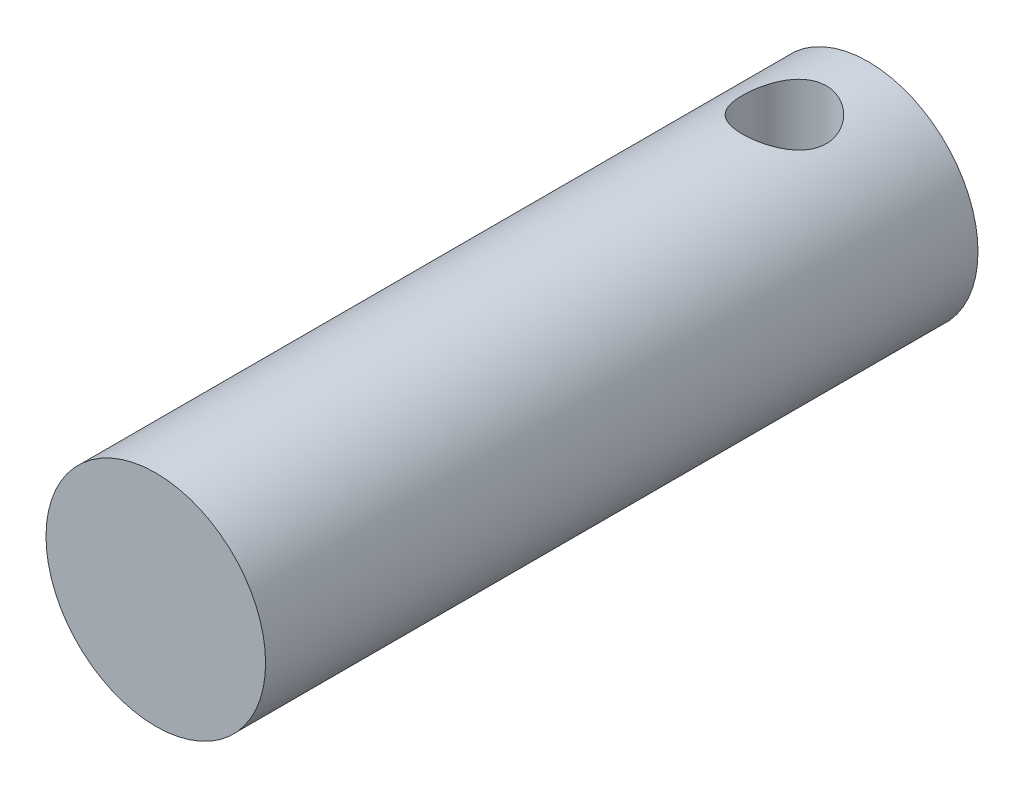
ISO-10303-21;
HEADER;
FILE_DESCRIPTION(('STEP AP214'),'2;1');
FILE_NAME('part.step','',(''),(''),'','','');
FILE_SCHEMA(('AUTOMOTIVE_DESIGN { 1 0 10303 214 1 1 1 1 }'));
ENDSEC;
DATA;
#1=APPLICATION_CONTEXT('core data for automotive mechanical design processes');
#2=APPLICATION_PROTOCOL_DEFINITION('international standard','automotive_design',2000,#1);
#3=PRODUCT_CONTEXT('',#1,'mechanical');
#4=PRODUCT('Part','Part','',(#3));
#5=PRODUCT_RELATED_PRODUCT_CATEGORY('part','',(#4));
#6=PRODUCT_DEFINITION_FORMATION('','',#4);
#7=PRODUCT_DEFINITION_CONTEXT('part definition',#1,'design');
#8=PRODUCT_DEFINITION('design','',#6,#7);
#9=PRODUCT_DEFINITION_SHAPE('','',#8);
#10=(LENGTH_UNIT() NAMED_UNIT(*) SI_UNIT(.MILLI.,.METRE.));
#11=(NAMED_UNIT(*) PLANE_ANGLE_UNIT() SI_UNIT($,.RADIAN.));
#12=(NAMED_UNIT(*) SI_UNIT($,.STERADIAN.) SOLID_ANGLE_UNIT());
#13=UNCERTAINTY_MEASURE_WITH_UNIT(LENGTH_MEASURE(1.E-05),#10,'distance_accuracy_value','');
#14=(GEOMETRIC_REPRESENTATION_CONTEXT(3) GLOBAL_UNCERTAINTY_ASSIGNED_CONTEXT((#13)) GLOBAL_UNIT_ASSIGNED_CONTEXT((#10,
#11,#12)) REPRESENTATION_CONTEXT('',''));
#15=CARTESIAN_POINT('',(0.,0.,0.));
#16=DIRECTION('',(0.,0.,1.));
#17=DIRECTION('',(1.,0.,0.));
#18=AXIS2_PLACEMENT_3D('',#15,#16,#17);
#19=CARTESIAN_POINT('',(0.,0.,17.));
#20=DIRECTION('',(0.,0.,-1.));
#21=DIRECTION('',(-1.,0.,0.));
#22=AXIS2_PLACEMENT_3D('',#19,#20,#21);
#23=CYLINDRICAL_SURFACE('',#22,2.62);
#24=CARTESIAN_POINT('',(0.,0.,17.));
#25=DIRECTION('',(0.,0.,1.));
#26=DIRECTION('',(1.,0.,0.));
#27=AXIS2_PLACEMENT_3D('',#24,#25,#26);
#28=CIRCLE('',#27,2.62);
#29=CARTESIAN_POINT('',(2.62,0.,17.));
#30=VERTEX_POINT('',#29);
#31=EDGE_CURVE('E10',#30,#30,#28,.T.);
#32=ORIENTED_EDGE('',*,*,#31,.F.);
#33=EDGE_LOOP('',(#32));
#34=FACE_BOUND('',#33,.T.);
#35=CARTESIAN_POINT('',(0.,0.,0.));
#36=DIRECTION('',(0.,0.,1.));
#37=DIRECTION('',(1.,0.,0.));
#38=AXIS2_PLACEMENT_3D('',#35,#36,#37);
#39=CIRCLE('',#38,2.62);
#40=CARTESIAN_POINT('',(2.62,0.,0.));
#41=VERTEX_POINT('',#40);
#42=EDGE_CURVE('E50',#41,#41,#39,.T.);
#43=ORIENTED_EDGE('',*,*,#42,.T.);
#44=EDGE_LOOP('',(#43));
#45=FACE_BOUND('',#44,.T.);
#46=CARTESIAN_POINT('',(0.,-2.62,1.));
#47=CARTESIAN_POINT('',(0.0540878208666477,-2.62000172446684,0.99999772664512));
#48=CARTESIAN_POINT('',(0.108160366600469,-2.61831068498683,1.00440183677598));
#49=CARTESIAN_POINT('',(0.214685738804756,-2.61173428545876,1.02182756036532));
#50=CARTESIAN_POINT('',(0.267138860040173,-2.60684951036181,1.03484759577267));
#51=CARTESIAN_POINT('',(0.368873399357626,-2.5944088374924,1.06897508940552));
#52=CARTESIAN_POINT('',(0.418160847573704,-2.58685820758275,1.09006660482913));
#53=CARTESIAN_POINT('',(0.512493236071322,-2.56983481980253,1.13965573965595));
#54=CARTESIAN_POINT('',(0.557536991890754,-2.56036152760886,1.16815541846606));
#55=CARTESIAN_POINT('',(0.644074722148286,-2.54000437693631,1.23305326348044));
#56=CARTESIAN_POINT('',(0.685358580568906,-2.52907961721934,1.26971865135058));
#57=CARTESIAN_POINT('',(0.76136204572585,-2.50724835379795,1.34933984724358));
#58=CARTESIAN_POINT('',(0.796079536950528,-2.49634185709525,1.39229767464306));
#59=CARTESIAN_POINT('',(0.859325043618497,-2.47530148905521,1.48536531616165));
#60=CARTESIAN_POINT('',(0.887552137640734,-2.46521556874333,1.53569155987673));
#61=CARTESIAN_POINT('',(0.935047756655343,-2.44759723296685,1.6408221754159));
#62=CARTESIAN_POINT('',(0.954320006454418,-2.44006375615597,1.69562467414881));
#63=CARTESIAN_POINT('',(0.982522548441762,-2.42884178101258,1.80573018850474));
#64=CARTESIAN_POINT('',(0.99185486067933,-2.42500447355949,1.86091454062245));
#65=CARTESIAN_POINT('',(1.00116938229341,-2.42117488390073,1.97218917578134));
#66=CARTESIAN_POINT('',(1.00115563358542,-2.42118093954565,2.0282790567112));
#67=CARTESIAN_POINT('',(0.992085082840309,-2.42490944970574,2.13604740508874));
#68=CARTESIAN_POINT('',(0.983592210929737,-2.42840014582448,2.1877828614108));
#69=CARTESIAN_POINT('',(0.958738866750376,-2.43831846032521,2.28902945492241));
#70=CARTESIAN_POINT('',(0.942377165703221,-2.4447465373941,2.33854024339213));
#71=CARTESIAN_POINT('',(0.901950519537709,-2.45995074678186,2.4350594197303));
#72=CARTESIAN_POINT('',(0.877742742001167,-2.46876987770788,2.4820009101563));
#73=CARTESIAN_POINT('',(0.822410838553503,-2.48774884024073,2.57131661270921));
#74=CARTESIAN_POINT('',(0.791284265320284,-2.49790914573115,2.61368920082451));
#75=CARTESIAN_POINT('',(0.720440477478131,-2.51929068661908,2.69577693422761));
#76=CARTESIAN_POINT('',(0.680275192943747,-2.53053646566719,2.73509996108101));
#77=CARTESIAN_POINT('',(0.593793223032846,-2.55221374172613,2.80657110354599));
#78=CARTESIAN_POINT('',(0.547475525091741,-2.56264510425058,2.83871803577597));
#79=CARTESIAN_POINT('',(0.44897415327127,-2.58173907586888,2.89537793729009));
#80=CARTESIAN_POINT('',(0.396706155057066,-2.59036958956611,2.91975590192575));
#81=CARTESIAN_POINT('',(0.288399104097771,-2.60465021701204,2.959241380481));
#82=CARTESIAN_POINT('',(0.232361802230769,-2.61030170391352,2.97435316607902));
#83=CARTESIAN_POINT('',(0.121403523595761,-2.61774379619442,2.99411326175768));
#84=CARTESIAN_POINT('',(0.0665894992146957,-2.61972890605589,2.99928931679607));
#85=CARTESIAN_POINT('',(-0.0431537653773452,-2.62021868599992,3.00057337027524));
#86=CARTESIAN_POINT('',(-0.0980829760072196,-2.61872416098086,2.99668346582554));
#87=CARTESIAN_POINT('',(-0.204187754317312,-2.6125507111139,2.98034386149573));
#88=CARTESIAN_POINT('',(-0.255425516051514,-2.60800188547349,2.96824366861472));
#89=CARTESIAN_POINT('',(-0.355104628558033,-2.59630911055016,2.93629116772627));
#90=CARTESIAN_POINT('',(-0.403545615313753,-2.58916482433139,2.91643785320394));
#91=CARTESIAN_POINT('',(-0.497873168877002,-2.57271915843769,2.86890430302704));
#92=CARTESIAN_POINT('',(-0.54364082603241,-2.5633599148793,2.84100873612054));
#93=CARTESIAN_POINT('',(-0.630001131131974,-2.54351433057423,2.77842467035898));
#94=CARTESIAN_POINT('',(-0.670591811902883,-2.53302756415888,2.74373360193771));
#95=CARTESIAN_POINT('',(-0.748000964812604,-2.5112959956948,2.66609074248418));
#96=CARTESIAN_POINT('',(-0.784445849019963,-2.5000435293651,2.62276766160571));
#97=CARTESIAN_POINT('',(-0.849626827589047,-2.47865173029746,2.53040469651781));
#98=CARTESIAN_POINT('',(-0.878362091509699,-2.46851251754297,2.48136419727267));
#99=CARTESIAN_POINT('',(-0.927373796575389,-2.45052376647107,2.37847182099489));
#100=CARTESIAN_POINT('',(-0.947602994409736,-2.44268708717702,2.32459503763835));
#101=CARTESIAN_POINT('',(-0.978562728648771,-2.43045210641921,2.213815227248));
#102=CARTESIAN_POINT('',(-0.989299432189484,-2.42605157275883,2.15691419054315));
#103=CARTESIAN_POINT('',(-1.00040794295825,-2.42149057435938,2.04576543368842));
#104=CARTESIAN_POINT('',(-1.00141975952395,-2.42106833155278,1.99159192449739));
#105=CARTESIAN_POINT('',(-0.9947002405702,-2.42383671862769,1.88388921993145));
#106=CARTESIAN_POINT('',(-0.98696979776051,-2.42702697962093,1.8303599593336));
#107=CARTESIAN_POINT('',(-0.963490180662272,-2.43643951167333,1.72725015572265));
#108=CARTESIAN_POINT('',(-0.948012026589797,-2.44255901878565,1.67759769970668));
#109=CARTESIAN_POINT('',(-0.90971887297074,-2.45707728453622,1.58156769953195));
#110=CARTESIAN_POINT('',(-0.886901988068925,-2.46547662878894,1.53519100066903));
#111=CARTESIAN_POINT('',(-0.833157233448128,-2.48416964401527,1.44431699764404));
#112=CARTESIAN_POINT('',(-0.801859293160633,-2.49454087311951,1.40005472590513));
#113=CARTESIAN_POINT('',(-0.732605191004796,-2.51575041043732,1.31720650566127));
#114=CARTESIAN_POINT('',(-0.694646874782511,-2.52658886892184,1.2786224012544));
#115=CARTESIAN_POINT('',(-0.610571453618804,-2.54825205841188,1.20598513347787));
#116=CARTESIAN_POINT('',(-0.564113137638654,-2.55904095976634,1.17231439940103));
#117=CARTESIAN_POINT('',(-0.465817017403103,-2.5787449325518,1.11326328514169));
#118=CARTESIAN_POINT('',(-0.413978462448214,-2.58765974196615,1.0878840639205));
#119=CARTESIAN_POINT('',(-0.303159189442599,-2.60303605588862,1.04510641178527));
#120=CARTESIAN_POINT('',(-0.243938057161228,-2.609323526262,1.02826173335292));
#121=CARTESIAN_POINT('',(-0.123137143644049,-2.61780339087266,1.00571288473849));
#122=CARTESIAN_POINT('',(-0.0615586786716762,-2.61999803734189,1.00000258736108));
#123=CARTESIAN_POINT('',(0.,-2.62,1.));
#124=B_SPLINE_CURVE_WITH_KNOTS('',3,(#46,#47,#48,#49,#50,#51,#52,#53,#54,#55,#56,#57,#58,#59,
#60,#61,#62,#63,#64,#65,#66,#67,#68,#69,#70,#71,#72,#73,#74,#75,#76,#77,#78,#79,#80,#81,#82,#83,
#84,#85,#86,#87,#88,#89,#90,#91,#92,#93,#94,#95,#96,#97,#98,#99,#100,#101,#102,#103,#104,#105,
#106,#107,#108,#109,#110,#111,#112,#113,#114,#115,#116,#117,#118,#119,#120,#121,#122,#123),
.UNSPECIFIED.,.T.,.F.,(4,2,2,2,2,2,2,2,2,2,2,2,2,2,2,2,2,2,2,2,2,2,2,2,2,2,2,2,2,2,2,2,2,2,2,2,
2,2,4),(0.,0.162036327120149,0.324042984662688,0.485731284337769,0.647464580154843,
0.815577695135475,0.98374487984584,1.15859734813341,1.33337702051789,1.50078279092005,
1.66811616295547,1.82501551661346,1.98193937927519,2.14189751771207,2.30191232696725,
2.47309967832613,2.6443152386993,2.81836161015007,2.99232768634823,3.15676579803758,
3.32116587619025,3.47897343343392,3.63680148416313,3.79932614897815,3.9619123878877,
4.13427502517795,4.30665622104755,4.47998257729425,4.6531962429936,4.81492561149411,
4.97663846660324,5.13305303713723,5.28950782346596,5.45437273316164,5.61929106841882,
5.7935876823189,5.96790864843294,6.15242774461733,6.3368452721587),.UNSPECIFIED.);
#125=CARTESIAN_POINT('',(0.,-2.62,1.));
#126=VERTEX_POINT('',#125);
#127=EDGE_CURVE('E57',#126,#126,#124,.T.);
#128=ORIENTED_EDGE('',*,*,#127,.F.);
#129=EDGE_LOOP('',(#128));
#130=FACE_BOUND('',#129,.T.);
#131=CARTESIAN_POINT('',(0.,2.62,1.));
#132=CARTESIAN_POINT('',(-0.0540878208666472,2.62000172446684,0.99999772664512));
#133=CARTESIAN_POINT('',(-0.108160366600468,2.61831068498683,1.00440183677598));
#134=CARTESIAN_POINT('',(-0.214685738804755,2.61173428545876,1.02182756036532));
#135=CARTESIAN_POINT('',(-0.267138860040173,2.60684951036181,1.03484759577267));
#136=CARTESIAN_POINT('',(-0.368873399357626,2.5944088374924,1.06897508940552));
#137=CARTESIAN_POINT('',(-0.418160847573703,2.58685820758275,1.09006660482913));
#138=CARTESIAN_POINT('',(-0.512493236071321,2.56983481980253,1.13965573965595));
#139=CARTESIAN_POINT('',(-0.557536991890753,2.56036152760886,1.16815541846606));
#140=CARTESIAN_POINT('',(-0.644074722148285,2.54000437693631,1.23305326348044));
#141=CARTESIAN_POINT('',(-0.685358580568905,2.52907961721934,1.26971865135058));
#142=CARTESIAN_POINT('',(-0.76136204572585,2.50724835379795,1.34933984724358));
#143=CARTESIAN_POINT('',(-0.796079536950528,2.49634185709525,1.39229767464306));
#144=CARTESIAN_POINT('',(-0.859325043618496,2.47530148905521,1.48536531616165));
#145=CARTESIAN_POINT('',(-0.887552137640734,2.46521556874333,1.53569155987673));
#146=CARTESIAN_POINT('',(-0.935047756655342,2.44759723296685,1.6408221754159));
#147=CARTESIAN_POINT('',(-0.954320006454418,2.44006375615597,1.69562467414881));
#148=CARTESIAN_POINT('',(-0.982522548441762,2.42884178101258,1.80573018850474));
#149=CARTESIAN_POINT('',(-0.99185486067933,2.42500447355949,1.86091454062245));
#150=CARTESIAN_POINT('',(-1.00116938229341,2.42117488390073,1.97218917578134));
#151=CARTESIAN_POINT('',(-1.00115563358542,2.42118093954565,2.0282790567112));
#152=CARTESIAN_POINT('',(-0.992085082840309,2.42490944970574,2.13604740508874));
#153=CARTESIAN_POINT('',(-0.983592210929737,2.42840014582448,2.1877828614108));
#154=CARTESIAN_POINT('',(-0.958738866750376,2.43831846032521,2.28902945492241));
#155=CARTESIAN_POINT('',(-0.942377165703221,2.4447465373941,2.33854024339213));
#156=CARTESIAN_POINT('',(-0.901950519537708,2.45995074678186,2.4350594197303));
#157=CARTESIAN_POINT('',(-0.877742742001166,2.46876987770788,2.4820009101563));
#158=CARTESIAN_POINT('',(-0.822410838553503,2.48774884024073,2.57131661270921));
#159=CARTESIAN_POINT('',(-0.791284265320284,2.49790914573115,2.61368920082451));
#160=CARTESIAN_POINT('',(-0.72044047747813,2.51929068661908,2.69577693422761));
#161=CARTESIAN_POINT('',(-0.680275192943747,2.53053646566719,2.73509996108101));
#162=CARTESIAN_POINT('',(-0.593793223032845,2.55221374172613,2.80657110354599));
#163=CARTESIAN_POINT('',(-0.547475525091741,2.56264510425058,2.83871803577597));
#164=CARTESIAN_POINT('',(-0.44897415327127,2.58173907586888,2.89537793729009));
#165=CARTESIAN_POINT('',(-0.396706155057066,2.59036958956611,2.91975590192575));
#166=CARTESIAN_POINT('',(-0.288399104097771,2.60465021701204,2.959241380481));
#167=CARTESIAN_POINT('',(-0.232361802230769,2.61030170391352,2.97435316607902));
#168=CARTESIAN_POINT('',(-0.121403523595761,2.61774379619442,2.99411326175768));
#169=CARTESIAN_POINT('',(-0.0665894992146957,2.61972890605589,2.99928931679607));
#170=CARTESIAN_POINT('',(0.0431537653773452,2.62021868599992,3.00057337027524));
#171=CARTESIAN_POINT('',(0.0980829760072196,2.61872416098086,2.99668346582554));
#172=CARTESIAN_POINT('',(0.204187754317312,2.6125507111139,2.98034386149573));
#173=CARTESIAN_POINT('',(0.255425516051514,2.60800188547349,2.96824366861472));
#174=CARTESIAN_POINT('',(0.355104628558033,2.59630911055016,2.93629116772627));
#175=CARTESIAN_POINT('',(0.403545615313753,2.58916482433139,2.91643785320394));
#176=CARTESIAN_POINT('',(0.497873168877003,2.57271915843769,2.86890430302704));
#177=CARTESIAN_POINT('',(0.543640826032411,2.5633599148793,2.84100873612054));
#178=CARTESIAN_POINT('',(0.630001131131974,2.54351433057423,2.77842467035898));
#179=CARTESIAN_POINT('',(0.670591811902883,2.53302756415888,2.74373360193771));
#180=CARTESIAN_POINT('',(0.748000964812604,2.5112959956948,2.66609074248418));
#181=CARTESIAN_POINT('',(0.784445849019963,2.5000435293651,2.62276766160571));
#182=CARTESIAN_POINT('',(0.849626827589047,2.47865173029746,2.53040469651781));
#183=CARTESIAN_POINT('',(0.878362091509699,2.46851251754297,2.48136419727267));
#184=CARTESIAN_POINT('',(0.927373796575389,2.45052376647107,2.37847182099489));
#185=CARTESIAN_POINT('',(0.947602994409737,2.44268708717702,2.32459503763835));
#186=CARTESIAN_POINT('',(0.978562728648771,2.43045210641921,2.213815227248));
#187=CARTESIAN_POINT('',(0.989299432189485,2.42605157275883,2.15691419054315));
#188=CARTESIAN_POINT('',(1.00040794295825,2.42149057435938,2.04576543368842));
#189=CARTESIAN_POINT('',(1.00141975952395,2.42106833155278,1.99159192449739));
#190=CARTESIAN_POINT('',(0.9947002405702,2.42383671862769,1.88388921993145));
#191=CARTESIAN_POINT('',(0.98696979776051,2.42702697962093,1.8303599593336));
#192=CARTESIAN_POINT('',(0.963490180662273,2.43643951167333,1.72725015572265));
#193=CARTESIAN_POINT('',(0.948012026589798,2.44255901878565,1.67759769970668));
#194=CARTESIAN_POINT('',(0.909718872970741,2.45707728453622,1.58156769953195));
#195=CARTESIAN_POINT('',(0.886901988068925,2.46547662878894,1.53519100066903));
#196=CARTESIAN_POINT('',(0.833157233448128,2.48416964401527,1.44431699764404));
#197=CARTESIAN_POINT('',(0.801859293160634,2.49454087311951,1.40005472590513));
#198=CARTESIAN_POINT('',(0.732605191004797,2.51575041043732,1.31720650566127));
#199=CARTESIAN_POINT('',(0.694646874782511,2.52658886892184,1.2786224012544));
#200=CARTESIAN_POINT('',(0.610571453618805,2.54825205841188,1.20598513347787));
#201=CARTESIAN_POINT('',(0.564113137638655,2.55904095976634,1.17231439940103));
#202=CARTESIAN_POINT('',(0.465817017403104,2.5787449325518,1.11326328514169));
#203=CARTESIAN_POINT('',(0.413978462448215,2.58765974196615,1.0878840639205));
#204=CARTESIAN_POINT('',(0.3031591894426,2.60303605588862,1.04510641178527));
#205=CARTESIAN_POINT('',(0.243938057161229,2.609323526262,1.02826173335292));
#206=CARTESIAN_POINT('',(0.12313714364405,2.61780339087266,1.00571288473849));
#207=CARTESIAN_POINT('',(0.061558678671677,2.61999803734189,1.00000258736108));
#208=CARTESIAN_POINT('',(0.,2.62,1.));
#209=B_SPLINE_CURVE_WITH_KNOTS('',3,(#131,#132,#133,#134,#135,#136,#137,#138,#139,#140,#141,
#142,#143,#144,#145,#146,#147,#148,#149,#150,#151,#152,#153,#154,#155,#156,#157,#158,#159,#160,
#161,#162,#163,#164,#165,#166,#167,#168,#169,#170,#171,#172,#173,#174,#175,#176,#177,#178,#179,
#180,#181,#182,#183,#184,#185,#186,#187,#188,#189,#190,#191,#192,#193,#194,#195,#196,#197,#198,
#199,#200,#201,#202,#203,#204,#205,#206,#207,#208),.UNSPECIFIED.,.T.,.F.,(4,2,2,2,2,2,2,2,2,2,2,
2,2,2,2,2,2,2,2,2,2,2,2,2,2,2,2,2,2,2,2,2,2,2,2,2,2,2,4),(0.,0.162036327120149,
0.324042984662688,0.485731284337769,0.647464580154843,0.815577695135475,0.98374487984584,
1.15859734813341,1.33337702051789,1.50078279092005,1.66811616295547,1.82501551661346,
1.98193937927519,2.14189751771207,2.30191232696725,2.47309967832613,2.6443152386993,
2.81836161015007,2.99232768634823,3.15676579803758,3.32116587619024,3.47897343343392,
3.63680148416313,3.79932614897815,3.9619123878877,4.13427502517795,4.30665622104755,
4.47998257729425,4.6531962429936,4.81492561149411,4.97663846660323,5.13305303713723,
5.28950782346596,5.45437273316163,5.61929106841882,5.7935876823189,5.96790864843294,
6.15242774461732,6.3368452721587),.UNSPECIFIED.);
#210=CARTESIAN_POINT('',(0.,2.62,1.));
#211=VERTEX_POINT('',#210);
#212=EDGE_CURVE('E41',#211,#211,#209,.T.);
#213=ORIENTED_EDGE('',*,*,#212,.F.);
#214=EDGE_LOOP('',(#213));
#215=FACE_BOUND('',#214,.T.);
#216=ADVANCED_FACE('F37',(#34,#45,#130,#215),#23,.T.);
#217=CARTESIAN_POINT('',(0.,0.,17.));
#218=DIRECTION('',(0.,0.,1.));
#219=DIRECTION('',(1.,0.,0.));
#220=AXIS2_PLACEMENT_3D('',#217,#218,#219);
#221=PLANE('',#220);
#222=ORIENTED_EDGE('',*,*,#31,.T.);
#223=EDGE_LOOP('',(#222));
#224=FACE_BOUND('',#223,.T.);
#225=ADVANCED_FACE('F69',(#224),#221,.T.);
#226=CARTESIAN_POINT('',(0.,0.,0.));
#227=DIRECTION('',(0.,0.,1.));
#228=DIRECTION('',(1.,0.,0.));
#229=AXIS2_PLACEMENT_3D('',#226,#227,#228);
#230=PLANE('',#229);
#231=ORIENTED_EDGE('',*,*,#42,.F.);
#232=EDGE_LOOP('',(#231));
#233=FACE_BOUND('',#232,.T.);
#234=ADVANCED_FACE('F67',(#233),#230,.F.);
#235=CARTESIAN_POINT('',(0.,10.,2.));
#236=DIRECTION('',(0.,-1.,0.));
#237=DIRECTION('',(0.,0.,-1.));
#238=AXIS2_PLACEMENT_3D('',#235,#236,#237);
#239=CYLINDRICAL_SURFACE('',#238,1.);
#240=ORIENTED_EDGE('',*,*,#127,.T.);
#241=EDGE_LOOP('',(#240));
#242=FACE_BOUND('',#241,.T.);
#243=ORIENTED_EDGE('',*,*,#212,.T.);
#244=EDGE_LOOP('',(#243));
#245=FACE_BOUND('',#244,.T.);
#246=ADVANCED_FACE('F63',(#242,#245),#239,.F.);
#247=CLOSED_SHELL('',(#216,#225,#234,#246));
#248=MANIFOLD_SOLID_BREP('B2',#247);
#249=ADVANCED_BREP_SHAPE_REPRESENTATION('',(#18,#248),#14);
#250=SHAPE_DEFINITION_REPRESENTATION(#9,#249);
ENDSEC;
END-ISO-10303-21;
